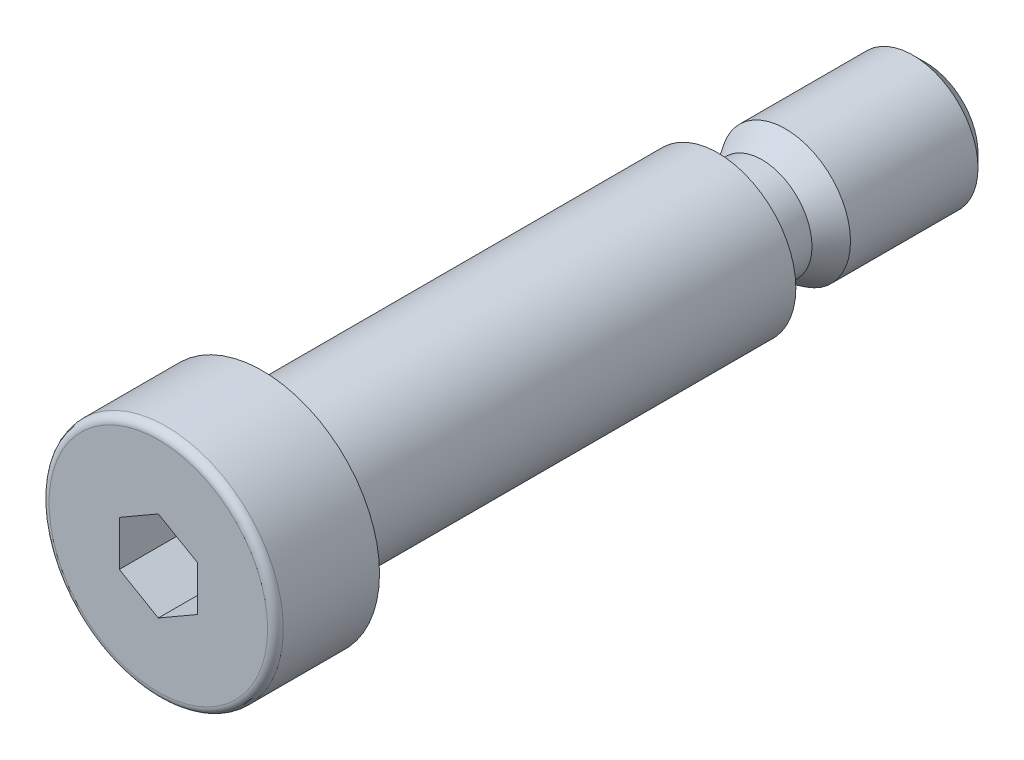
ISO-10303-21;
HEADER;
FILE_DESCRIPTION(('STEP AP214'),'2;1');
FILE_NAME('part.step','',(''),(''),'','','');
FILE_SCHEMA(('AUTOMOTIVE_DESIGN { 1 0 10303 214 1 1 1 1 }'));
ENDSEC;
DATA;
#1=APPLICATION_CONTEXT('core data for automotive mechanical design processes');
#2=APPLICATION_PROTOCOL_DEFINITION('international standard','automotive_design',2000,#1);
#3=PRODUCT_CONTEXT('',#1,'mechanical');
#4=PRODUCT('Part','Part','',(#3));
#5=PRODUCT_RELATED_PRODUCT_CATEGORY('part','',(#4));
#6=PRODUCT_DEFINITION_FORMATION('','',#4);
#7=PRODUCT_DEFINITION_CONTEXT('part definition',#1,'design');
#8=PRODUCT_DEFINITION('design','',#6,#7);
#9=PRODUCT_DEFINITION_SHAPE('','',#8);
#10=(LENGTH_UNIT() NAMED_UNIT(*) SI_UNIT(.MILLI.,.METRE.));
#11=(NAMED_UNIT(*) PLANE_ANGLE_UNIT() SI_UNIT($,.RADIAN.));
#12=(NAMED_UNIT(*) SI_UNIT($,.STERADIAN.) SOLID_ANGLE_UNIT());
#13=UNCERTAINTY_MEASURE_WITH_UNIT(LENGTH_MEASURE(1.E-05),#10,'distance_accuracy_value','');
#14=(GEOMETRIC_REPRESENTATION_CONTEXT(3) GLOBAL_UNCERTAINTY_ASSIGNED_CONTEXT((#13)) GLOBAL_UNIT_ASSIGNED_CONTEXT((#10,
#11,#12)) REPRESENTATION_CONTEXT('',''));
#15=CARTESIAN_POINT('',(0.,0.,0.));
#16=DIRECTION('',(0.,0.,1.));
#17=DIRECTION('',(1.,0.,0.));
#18=AXIS2_PLACEMENT_3D('',#15,#16,#17);
#19=CARTESIAN_POINT('',(0.,0.,25.5));
#20=DIRECTION('',(0.,0.,1.));
#21=DIRECTION('',(1.,0.,0.));
#22=AXIS2_PLACEMENT_3D('',#19,#20,#21);
#23=PLANE('',#22);
#24=CARTESIAN_POINT('',(0.,0.,25.5));
#25=DIRECTION('',(0.,0.,1.));
#26=DIRECTION('',(1.,0.,0.));
#27=AXIS2_PLACEMENT_3D('',#24,#25,#26);
#28=CIRCLE('',#27,8.4);
#29=CARTESIAN_POINT('',(8.4,0.,25.5));
#30=VERTEX_POINT('',#29);
#31=EDGE_CURVE('E42',#30,#30,#28,.T.);
#32=ORIENTED_EDGE('',*,*,#31,.T.);
#33=EDGE_LOOP('',(#32));
#34=FACE_BOUND('',#33,.T.);
#35=DIRECTION('',(0.,1.,0.));
#36=VECTOR('',#35,1.);
#37=CARTESIAN_POINT('',(3.,-1.73205080756888,25.5));
#38=LINE('',#37,#36);
#39=CARTESIAN_POINT('',(3.,-1.73205080756888,25.5));
#40=VERTEX_POINT('',#39);
#41=CARTESIAN_POINT('',(3.,1.73205080756888,25.5));
#42=VERTEX_POINT('',#41);
#43=EDGE_CURVE('E49',#40,#42,#38,.T.);
#44=ORIENTED_EDGE('',*,*,#43,.F.);
#45=DIRECTION('',(0.866025403784439,0.5,0.));
#46=VECTOR('',#45,1.);
#47=CARTESIAN_POINT('',(0.,-3.46410161513775,25.5));
#48=LINE('',#47,#46);
#49=CARTESIAN_POINT('',(0.,-3.46410161513775,25.5));
#50=VERTEX_POINT('',#49);
#51=EDGE_CURVE('E132',#50,#40,#48,.T.);
#52=ORIENTED_EDGE('',*,*,#51,.F.);
#53=DIRECTION('',(0.866025403784439,-0.5,0.));
#54=VECTOR('',#53,1.);
#55=CARTESIAN_POINT('',(-3.,-1.73205080756888,25.5));
#56=LINE('',#55,#54);
#57=CARTESIAN_POINT('',(-3.,-1.73205080756888,25.5));
#58=VERTEX_POINT('',#57);
#59=EDGE_CURVE('E130',#58,#50,#56,.T.);
#60=ORIENTED_EDGE('',*,*,#59,.F.);
#61=DIRECTION('',(0.,-1.,0.));
#62=VECTOR('',#61,1.);
#63=CARTESIAN_POINT('',(-3.,1.73205080756888,25.5));
#64=LINE('',#63,#62);
#65=CARTESIAN_POINT('',(-3.,1.73205080756888,25.5));
#66=VERTEX_POINT('',#65);
#67=EDGE_CURVE('E97',#66,#58,#64,.T.);
#68=ORIENTED_EDGE('',*,*,#67,.F.);
#69=DIRECTION('',(-0.866025403784439,-0.5,0.));
#70=VECTOR('',#69,1.);
#71=CARTESIAN_POINT('',(0.,3.46410161513775,25.5));
#72=LINE('',#71,#70);
#73=CARTESIAN_POINT('',(0.,3.46410161513775,25.5));
#74=VERTEX_POINT('',#73);
#75=EDGE_CURVE('E126',#74,#66,#72,.T.);
#76=ORIENTED_EDGE('',*,*,#75,.F.);
#77=DIRECTION('',(-0.866025403784439,0.5,0.));
#78=VECTOR('',#77,1.);
#79=CARTESIAN_POINT('',(3.,1.73205080756888,25.5));
#80=LINE('',#79,#78);
#81=EDGE_CURVE('E123',#42,#74,#80,.T.);
#82=ORIENTED_EDGE('',*,*,#81,.F.);
#83=EDGE_LOOP('',(#44,#52,#60,#68,#76,#82));
#84=FACE_BOUND('',#83,.T.);
#85=ADVANCED_FACE('F34',(#34,#84),#23,.T.);
#86=CARTESIAN_POINT('',(0.,0.,-33.5));
#87=DIRECTION('',(0.,0.,1.));
#88=DIRECTION('',(1.,0.,0.));
#89=AXIS2_PLACEMENT_3D('',#86,#87,#88);
#90=PLANE('',#89);
#91=CARTESIAN_POINT('',(0.,0.,-33.5));
#92=DIRECTION('',(0.,0.,1.));
#93=DIRECTION('',(1.,0.,0.));
#94=AXIS2_PLACEMENT_3D('',#91,#92,#93);
#95=CIRCLE('',#94,4.);
#96=CARTESIAN_POINT('',(4.,0.,-33.5));
#97=VERTEX_POINT('',#96);
#98=EDGE_CURVE('E162',#97,#97,#95,.T.);
#99=ORIENTED_EDGE('',*,*,#98,.F.);
#100=EDGE_LOOP('',(#99));
#101=FACE_BOUND('',#100,.T.);
#102=ADVANCED_FACE('F178',(#101),#90,.F.);
#103=CARTESIAN_POINT('',(0.,0.,-33.5));
#104=DIRECTION('',(0.,0.,1.));
#105=DIRECTION('',(1.,0.,0.));
#106=AXIS2_PLACEMENT_3D('',#103,#104,#105);
#107=CONICAL_SURFACE('',#106,4.,0.785398163397447);
#108=CARTESIAN_POINT('',(0.,0.,-32.5));
#109=DIRECTION('',(0.,0.,1.));
#110=DIRECTION('',(1.,0.,0.));
#111=AXIS2_PLACEMENT_3D('',#108,#109,#110);
#112=CIRCLE('',#111,5.);
#113=CARTESIAN_POINT('',(5.,0.,-32.5));
#114=VERTEX_POINT('',#113);
#115=EDGE_CURVE('E159',#114,#114,#112,.T.);
#116=ORIENTED_EDGE('',*,*,#115,.F.);
#117=EDGE_LOOP('',(#116));
#118=FACE_BOUND('',#117,.T.);
#119=ORIENTED_EDGE('',*,*,#98,.T.);
#120=EDGE_LOOP('',(#119));
#121=FACE_BOUND('',#120,.T.);
#122=ADVANCED_FACE('F182',(#118,#121),#107,.T.);
#123=CARTESIAN_POINT('',(0.,0.,25.5));
#124=DIRECTION('',(0.,0.,1.));
#125=DIRECTION('',(1.,0.,0.));
#126=AXIS2_PLACEMENT_3D('',#123,#124,#125);
#127=CYLINDRICAL_SURFACE('',#126,5.);
#128=CARTESIAN_POINT('',(0.,0.,-22.7));
#129=DIRECTION('',(0.,0.,1.));
#130=DIRECTION('',(1.,0.,0.));
#131=AXIS2_PLACEMENT_3D('',#128,#129,#130);
#132=CIRCLE('',#131,5.);
#133=CARTESIAN_POINT('',(5.,0.,-22.7));
#134=VERTEX_POINT('',#133);
#135=EDGE_CURVE('E156',#134,#134,#132,.T.);
#136=ORIENTED_EDGE('',*,*,#135,.F.);
#137=EDGE_LOOP('',(#136));
#138=FACE_BOUND('',#137,.T.);
#139=ORIENTED_EDGE('',*,*,#115,.T.);
#140=EDGE_LOOP('',(#139));
#141=FACE_BOUND('',#140,.T.);
#142=ADVANCED_FACE('F188',(#138,#141),#127,.T.);
#143=CARTESIAN_POINT('',(0.,0.,-22.7));
#144=DIRECTION('',(0.,0.,-1.));
#145=DIRECTION('',(-1.,0.,0.));
#146=AXIS2_PLACEMENT_3D('',#143,#144,#145);
#147=CONICAL_SURFACE('',#146,5.,0.566013910063244);
#148=CARTESIAN_POINT('',(0.,0.,-20.89));
#149=DIRECTION('',(0.,0.,1.));
#150=DIRECTION('',(1.,0.,0.));
#151=AXIS2_PLACEMENT_3D('',#148,#149,#150);
#152=CIRCLE('',#151,3.85);
#153=CARTESIAN_POINT('',(3.85,0.,-20.89));
#154=VERTEX_POINT('',#153);
#155=EDGE_CURVE('E153',#154,#154,#152,.T.);
#156=ORIENTED_EDGE('',*,*,#155,.F.);
#157=EDGE_LOOP('',(#156));
#158=FACE_BOUND('',#157,.T.);
#159=ORIENTED_EDGE('',*,*,#135,.T.);
#160=EDGE_LOOP('',(#159));
#161=FACE_BOUND('',#160,.T.);
#162=ADVANCED_FACE('F192',(#158,#161),#147,.T.);
#163=CARTESIAN_POINT('',(0.,0.,25.5));
#164=DIRECTION('',(0.,0.,1.));
#165=DIRECTION('',(1.,0.,0.));
#166=AXIS2_PLACEMENT_3D('',#163,#164,#165);
#167=CYLINDRICAL_SURFACE('',#166,3.85);
#168=ORIENTED_EDGE('',*,*,#155,.T.);
#169=EDGE_LOOP('',(#168));
#170=FACE_BOUND('',#169,.T.);
#171=CARTESIAN_POINT('',(0.,0.,-17.5));
#172=DIRECTION('',(0.,0.,1.));
#173=DIRECTION('',(1.,0.,0.));
#174=AXIS2_PLACEMENT_3D('',#171,#172,#173);
#175=CIRCLE('',#174,3.85);
#176=CARTESIAN_POINT('',(3.85,0.,-17.5));
#177=VERTEX_POINT('',#176);
#178=EDGE_CURVE('E150',#177,#177,#175,.T.);
#179=ORIENTED_EDGE('',*,*,#178,.F.);
#180=EDGE_LOOP('',(#179));
#181=FACE_BOUND('',#180,.T.);
#182=ADVANCED_FACE('F196',(#170,#181),#167,.T.);
#183=CARTESIAN_POINT('',(0.,0.,-17.5));
#184=DIRECTION('',(0.,0.,1.));
#185=DIRECTION('',(1.,0.,0.));
#186=AXIS2_PLACEMENT_3D('',#183,#184,#185);
#187=PLANE('',#186);
#188=CARTESIAN_POINT('',(0.,0.,-17.5));
#189=DIRECTION('',(0.,0.,1.));
#190=DIRECTION('',(1.,0.,0.));
#191=AXIS2_PLACEMENT_3D('',#188,#189,#190);
#192=CIRCLE('',#191,6.);
#193=CARTESIAN_POINT('',(6.,0.,-17.5));
#194=VERTEX_POINT('',#193);
#195=EDGE_CURVE('E147',#194,#194,#192,.T.);
#196=ORIENTED_EDGE('',*,*,#195,.F.);
#197=EDGE_LOOP('',(#196));
#198=FACE_BOUND('',#197,.T.);
#199=ORIENTED_EDGE('',*,*,#178,.T.);
#200=EDGE_LOOP('',(#199));
#201=FACE_BOUND('',#200,.T.);
#202=ADVANCED_FACE('F200',(#198,#201),#187,.F.);
#203=CARTESIAN_POINT('',(0.,0.,25.5));
#204=DIRECTION('',(0.,0.,1.));
#205=DIRECTION('',(1.,0.,0.));
#206=AXIS2_PLACEMENT_3D('',#203,#204,#205);
#207=CYLINDRICAL_SURFACE('',#206,6.);
#208=ORIENTED_EDGE('',*,*,#195,.T.);
#209=EDGE_LOOP('',(#208));
#210=FACE_BOUND('',#209,.T.);
#211=CARTESIAN_POINT('',(0.,0.,17.5));
#212=DIRECTION('',(0.,0.,1.));
#213=DIRECTION('',(1.,0.,0.));
#214=AXIS2_PLACEMENT_3D('',#211,#212,#213);
#215=CIRCLE('',#214,6.);
#216=CARTESIAN_POINT('',(6.,0.,17.5));
#217=VERTEX_POINT('',#216);
#218=EDGE_CURVE('E144',#217,#217,#215,.T.);
#219=ORIENTED_EDGE('',*,*,#218,.F.);
#220=EDGE_LOOP('',(#219));
#221=FACE_BOUND('',#220,.T.);
#222=ADVANCED_FACE('F204',(#210,#221),#207,.T.);
#223=CARTESIAN_POINT('',(0.,0.,17.5));
#224=DIRECTION('',(0.,0.,1.));
#225=DIRECTION('',(1.,0.,0.));
#226=AXIS2_PLACEMENT_3D('',#223,#224,#225);
#227=PLANE('',#226);
#228=CARTESIAN_POINT('',(0.,0.,17.5));
#229=DIRECTION('',(0.,0.,1.));
#230=DIRECTION('',(1.,0.,0.));
#231=AXIS2_PLACEMENT_3D('',#228,#229,#230);
#232=CIRCLE('',#231,9.);
#233=CARTESIAN_POINT('',(9.,0.,17.5));
#234=VERTEX_POINT('',#233);
#235=EDGE_CURVE('E136',#234,#234,#232,.T.);
#236=ORIENTED_EDGE('',*,*,#235,.F.);
#237=EDGE_LOOP('',(#236));
#238=FACE_BOUND('',#237,.T.);
#239=ORIENTED_EDGE('',*,*,#218,.T.);
#240=EDGE_LOOP('',(#239));
#241=FACE_BOUND('',#240,.T.);
#242=ADVANCED_FACE('F208',(#238,#241),#227,.F.);
#243=CARTESIAN_POINT('',(0.,0.,25.5));
#244=DIRECTION('',(0.,0.,1.));
#245=DIRECTION('',(1.,0.,0.));
#246=AXIS2_PLACEMENT_3D('',#243,#244,#245);
#247=CYLINDRICAL_SURFACE('',#246,9.);
#248=CARTESIAN_POINT('',(0.,0.,24.9));
#249=DIRECTION('',(0.,0.,1.));
#250=DIRECTION('',(1.,0.,0.));
#251=AXIS2_PLACEMENT_3D('',#248,#249,#250);
#252=CIRCLE('',#251,9.);
#253=CARTESIAN_POINT('',(9.,0.,24.9));
#254=VERTEX_POINT('',#253);
#255=EDGE_CURVE('E11',#254,#254,#252,.F.);
#256=ORIENTED_EDGE('',*,*,#255,.T.);
#257=EDGE_LOOP('',(#256));
#258=FACE_BOUND('',#257,.T.);
#259=ORIENTED_EDGE('',*,*,#235,.T.);
#260=EDGE_LOOP('',(#259));
#261=FACE_BOUND('',#260,.T.);
#262=ADVANCED_FACE('F212',(#258,#261),#247,.T.);
#263=CARTESIAN_POINT('',(3.,-1.73205080756888,20.6));
#264=DIRECTION('',(1.,0.,0.));
#265=DIRECTION('',(0.,1.,0.));
#266=AXIS2_PLACEMENT_3D('',#263,#264,#265);
#267=PLANE('',#266);
#268=ORIENTED_EDGE('',*,*,#43,.T.);
#269=DIRECTION('',(0.,0.,1.));
#270=VECTOR('',#269,1.);
#271=CARTESIAN_POINT('',(3.,1.73205080756888,20.6));
#272=LINE('',#271,#270);
#273=CARTESIAN_POINT('',(3.,1.73205080756888,20.6));
#274=VERTEX_POINT('',#273);
#275=EDGE_CURVE('E79',#274,#42,#272,.T.);
#276=ORIENTED_EDGE('',*,*,#275,.F.);
#277=DIRECTION('',(0.,1.,0.));
#278=VECTOR('',#277,1.);
#279=CARTESIAN_POINT('',(3.,-1.73205080756888,20.6));
#280=LINE('',#279,#278);
#281=CARTESIAN_POINT('',(3.,-1.73205080756888,20.6));
#282=VERTEX_POINT('',#281);
#283=EDGE_CURVE('E134',#282,#274,#280,.T.);
#284=ORIENTED_EDGE('',*,*,#283,.F.);
#285=DIRECTION('',(0.,0.,1.));
#286=VECTOR('',#285,1.);
#287=CARTESIAN_POINT('',(3.,-1.73205080756888,20.6));
#288=LINE('',#287,#286);
#289=EDGE_CURVE('E57',#282,#40,#288,.T.);
#290=ORIENTED_EDGE('',*,*,#289,.T.);
#291=EDGE_LOOP('',(#268,#276,#284,#290));
#292=FACE_BOUND('',#291,.T.);
#293=ADVANCED_FACE('F216',(#292),#267,.F.);
#294=CARTESIAN_POINT('',(0.,-3.46410161513775,20.6));
#295=DIRECTION('',(0.5,-0.866025403784439,0.));
#296=DIRECTION('',(0.866025403784439,0.5,0.));
#297=AXIS2_PLACEMENT_3D('',#294,#295,#296);
#298=PLANE('',#297);
#299=ORIENTED_EDGE('',*,*,#51,.T.);
#300=ORIENTED_EDGE('',*,*,#289,.F.);
#301=DIRECTION('',(0.866025403784439,0.5,0.));
#302=VECTOR('',#301,1.);
#303=CARTESIAN_POINT('',(0.,-3.46410161513775,20.6));
#304=LINE('',#303,#302);
#305=CARTESIAN_POINT('',(0.,-3.46410161513775,20.6));
#306=VERTEX_POINT('',#305);
#307=EDGE_CURVE('E109',#306,#282,#304,.T.);
#308=ORIENTED_EDGE('',*,*,#307,.F.);
#309=DIRECTION('',(0.,0.,1.));
#310=VECTOR('',#309,1.);
#311=CARTESIAN_POINT('',(0.,-3.46410161513775,20.6));
#312=LINE('',#311,#310);
#313=EDGE_CURVE('E101',#306,#50,#312,.T.);
#314=ORIENTED_EDGE('',*,*,#313,.T.);
#315=EDGE_LOOP('',(#299,#300,#308,#314));
#316=FACE_BOUND('',#315,.T.);
#317=ADVANCED_FACE('F220',(#316),#298,.F.);
#318=CARTESIAN_POINT('',(-3.,-1.73205080756888,20.6));
#319=DIRECTION('',(-0.5,-0.866025403784439,0.));
#320=DIRECTION('',(0.866025403784439,-0.5,0.));
#321=AXIS2_PLACEMENT_3D('',#318,#319,#320);
#322=PLANE('',#321);
#323=ORIENTED_EDGE('',*,*,#59,.T.);
#324=ORIENTED_EDGE('',*,*,#313,.F.);
#325=DIRECTION('',(0.866025403784439,-0.5,0.));
#326=VECTOR('',#325,1.);
#327=CARTESIAN_POINT('',(-3.,-1.73205080756888,20.6));
#328=LINE('',#327,#326);
#329=CARTESIAN_POINT('',(-3.,-1.73205080756888,20.6));
#330=VERTEX_POINT('',#329);
#331=EDGE_CURVE('E105',#330,#306,#328,.T.);
#332=ORIENTED_EDGE('',*,*,#331,.F.);
#333=DIRECTION('',(0.,0.,1.));
#334=VECTOR('',#333,1.);
#335=CARTESIAN_POINT('',(-3.,-1.73205080756888,20.6));
#336=LINE('',#335,#334);
#337=EDGE_CURVE('E90',#330,#58,#336,.T.);
#338=ORIENTED_EDGE('',*,*,#337,.T.);
#339=EDGE_LOOP('',(#323,#324,#332,#338));
#340=FACE_BOUND('',#339,.T.);
#341=ADVANCED_FACE('F106',(#340),#322,.F.);
#342=CARTESIAN_POINT('',(-3.,1.73205080756888,20.6));
#343=DIRECTION('',(-1.,0.,0.));
#344=DIRECTION('',(0.,0.,1.));
#345=AXIS2_PLACEMENT_3D('',#342,#343,#344);
#346=PLANE('',#345);
#347=ORIENTED_EDGE('',*,*,#67,.T.);
#348=ORIENTED_EDGE('',*,*,#337,.F.);
#349=DIRECTION('',(0.,-1.,0.));
#350=VECTOR('',#349,1.);
#351=CARTESIAN_POINT('',(-3.,1.73205080756888,20.6));
#352=LINE('',#351,#350);
#353=CARTESIAN_POINT('',(-3.,1.73205080756888,20.6));
#354=VERTEX_POINT('',#353);
#355=EDGE_CURVE('E94',#354,#330,#352,.T.);
#356=ORIENTED_EDGE('',*,*,#355,.F.);
#357=DIRECTION('',(0.,0.,1.));
#358=VECTOR('',#357,1.);
#359=CARTESIAN_POINT('',(-3.,1.73205080756888,20.6));
#360=LINE('',#359,#358);
#361=EDGE_CURVE('E102',#354,#66,#360,.T.);
#362=ORIENTED_EDGE('',*,*,#361,.T.);
#363=EDGE_LOOP('',(#347,#348,#356,#362));
#364=FACE_BOUND('',#363,.T.);
#365=ADVANCED_FACE('F92',(#364),#346,.F.);
#366=CARTESIAN_POINT('',(0.,3.46410161513775,20.6));
#367=DIRECTION('',(-0.5,0.866025403784439,0.));
#368=DIRECTION('',(-0.866025403784439,-0.5,0.));
#369=AXIS2_PLACEMENT_3D('',#366,#367,#368);
#370=PLANE('',#369);
#371=ORIENTED_EDGE('',*,*,#75,.T.);
#372=ORIENTED_EDGE('',*,*,#361,.F.);
#373=DIRECTION('',(-0.866025403784439,-0.5,0.));
#374=VECTOR('',#373,1.);
#375=CARTESIAN_POINT('',(0.,3.46410161513775,20.6));
#376=LINE('',#375,#374);
#377=CARTESIAN_POINT('',(0.,3.46410161513775,20.6));
#378=VERTEX_POINT('',#377);
#379=EDGE_CURVE('E115',#378,#354,#376,.T.);
#380=ORIENTED_EDGE('',*,*,#379,.F.);
#381=DIRECTION('',(0.,0.,1.));
#382=VECTOR('',#381,1.);
#383=CARTESIAN_POINT('',(0.,3.46410161513775,20.6));
#384=LINE('',#383,#382);
#385=EDGE_CURVE('E139',#378,#74,#384,.T.);
#386=ORIENTED_EDGE('',*,*,#385,.T.);
#387=EDGE_LOOP('',(#371,#372,#380,#386));
#388=FACE_BOUND('',#387,.T.);
#389=ADVANCED_FACE('F223',(#388),#370,.F.);
#390=CARTESIAN_POINT('',(3.,1.73205080756888,20.6));
#391=DIRECTION('',(0.5,0.866025403784439,0.));
#392=DIRECTION('',(-0.866025403784439,0.5,0.));
#393=AXIS2_PLACEMENT_3D('',#390,#391,#392);
#394=PLANE('',#393);
#395=ORIENTED_EDGE('',*,*,#81,.T.);
#396=ORIENTED_EDGE('',*,*,#385,.F.);
#397=DIRECTION('',(-0.866025403784439,0.5,0.));
#398=VECTOR('',#397,1.);
#399=CARTESIAN_POINT('',(3.,1.73205080756888,20.6));
#400=LINE('',#399,#398);
#401=EDGE_CURVE('E117',#274,#378,#400,.T.);
#402=ORIENTED_EDGE('',*,*,#401,.F.);
#403=ORIENTED_EDGE('',*,*,#275,.T.);
#404=EDGE_LOOP('',(#395,#396,#402,#403));
#405=FACE_BOUND('',#404,.T.);
#406=ADVANCED_FACE('F174',(#405),#394,.F.);
#407=CARTESIAN_POINT('',(0.,0.,20.6));
#408=DIRECTION('',(0.,0.,1.));
#409=DIRECTION('',(1.,0.,0.));
#410=AXIS2_PLACEMENT_3D('',#407,#408,#409);
#411=PLANE('',#410);
#412=ORIENTED_EDGE('',*,*,#283,.T.);
#413=ORIENTED_EDGE('',*,*,#401,.T.);
#414=ORIENTED_EDGE('',*,*,#379,.T.);
#415=ORIENTED_EDGE('',*,*,#355,.T.);
#416=ORIENTED_EDGE('',*,*,#331,.T.);
#417=ORIENTED_EDGE('',*,*,#307,.T.);
#418=EDGE_LOOP('',(#412,#413,#414,#415,#416,#417));
#419=FACE_BOUND('',#418,.T.);
#420=ADVANCED_FACE('F112',(#419),#411,.T.);
#421=CARTESIAN_POINT('',(0.,0.,24.9));
#422=DIRECTION('',(0.,0.,1.));
#423=DIRECTION('',(1.,0.,0.));
#424=AXIS2_PLACEMENT_3D('',#421,#422,#423);
#425=TOROIDAL_SURFACE('',#424,8.4,0.6);
#426=ORIENTED_EDGE('',*,*,#255,.F.);
#427=EDGE_LOOP('',(#426));
#428=FACE_BOUND('',#427,.T.);
#429=ORIENTED_EDGE('',*,*,#31,.F.);
#430=EDGE_LOOP('',(#429));
#431=FACE_BOUND('',#430,.T.);
#432=ADVANCED_FACE('F36',(#428,#431),#425,.T.);
#433=CLOSED_SHELL('',(#85,#102,#122,#142,#162,#182,#202,#222,#242,#262,#293,#317,#341,#365,#389,
#406,#420,#432));
#434=MANIFOLD_SOLID_BREP('B2',#433);
#435=ADVANCED_BREP_SHAPE_REPRESENTATION('',(#18,#434),#14);
#436=SHAPE_DEFINITION_REPRESENTATION(#9,#435);
ENDSEC;
END-ISO-10303-21;
